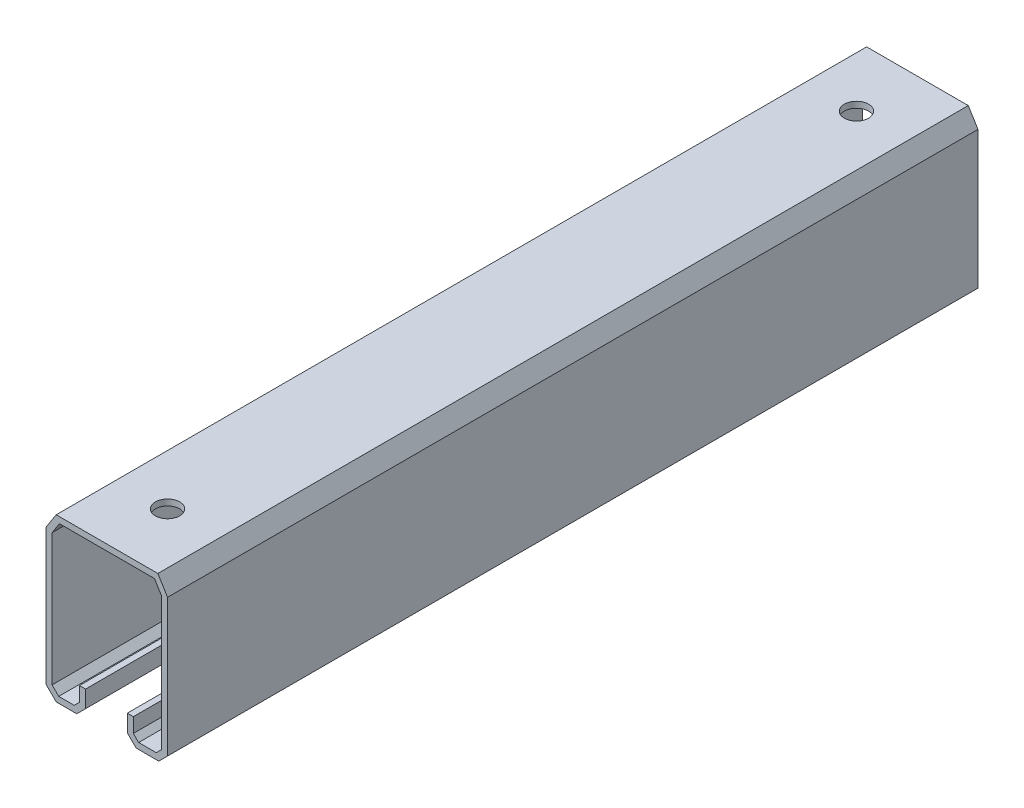
ISO-10303-21;
HEADER;
FILE_DESCRIPTION(('STEP AP214'),'2;1');
FILE_NAME('part.step','',(''),(''),'','','');
FILE_SCHEMA(('AUTOMOTIVE_DESIGN { 1 0 10303 214 1 1 1 1 }'));
ENDSEC;
DATA;
#1=APPLICATION_CONTEXT('core data for automotive mechanical design processes');
#2=APPLICATION_PROTOCOL_DEFINITION('international standard','automotive_design',2000,#1);
#3=PRODUCT_CONTEXT('',#1,'mechanical');
#4=PRODUCT('Part','Part','',(#3));
#5=PRODUCT_RELATED_PRODUCT_CATEGORY('part','',(#4));
#6=PRODUCT_DEFINITION_FORMATION('','',#4);
#7=PRODUCT_DEFINITION_CONTEXT('part definition',#1,'design');
#8=PRODUCT_DEFINITION('design','',#6,#7);
#9=PRODUCT_DEFINITION_SHAPE('','',#8);
#10=(LENGTH_UNIT() NAMED_UNIT(*) SI_UNIT(.MILLI.,.METRE.));
#11=(NAMED_UNIT(*) PLANE_ANGLE_UNIT() SI_UNIT($,.RADIAN.));
#12=(NAMED_UNIT(*) SI_UNIT($,.STERADIAN.) SOLID_ANGLE_UNIT());
#13=UNCERTAINTY_MEASURE_WITH_UNIT(LENGTH_MEASURE(1.E-05),#10,'distance_accuracy_value','');
#14=(GEOMETRIC_REPRESENTATION_CONTEXT(3) GLOBAL_UNCERTAINTY_ASSIGNED_CONTEXT((#13)) GLOBAL_UNIT_ASSIGNED_CONTEXT((#10,
#11,#12)) REPRESENTATION_CONTEXT('',''));
#15=CARTESIAN_POINT('',(0.,0.,0.));
#16=DIRECTION('',(0.,0.,1.));
#17=DIRECTION('',(1.,0.,0.));
#18=AXIS2_PLACEMENT_3D('',#15,#16,#17);
#19=CARTESIAN_POINT('',(-13.4697478975894,-27.2401516069639,200.));
#20=DIRECTION('',(0.,-1.,0.));
#21=DIRECTION('',(0.,0.,-1.));
#22=AXIS2_PLACEMENT_3D('',#19,#20,#21);
#23=PLANE('',#22);
#24=DIRECTION('',(-1.,0.,0.));
#25=VECTOR('',#24,1.);
#26=CARTESIAN_POINT('',(-13.4697478975894,-27.2401516069639,-200.));
#27=LINE('',#26,#25);
#28=CARTESIAN_POINT('',(-10.4697478975894,-27.2401516069639,-200.));
#29=VERTEX_POINT('',#28);
#30=CARTESIAN_POINT('',(-13.4697478975894,-27.2401516069639,-200.));
#31=VERTEX_POINT('',#30);
#32=EDGE_CURVE('E249',#29,#31,#27,.T.);
#33=ORIENTED_EDGE('',*,*,#32,.T.);
#34=DIRECTION('',(0.,0.,-1.));
#35=VECTOR('',#34,1.);
#36=CARTESIAN_POINT('',(-13.4697478975894,-27.2401516069639,200.));
#37=LINE('',#36,#35);
#38=CARTESIAN_POINT('',(-13.4697478975894,-27.2401516069639,200.));
#39=VERTEX_POINT('',#38);
#40=EDGE_CURVE('E11',#39,#31,#37,.T.);
#41=ORIENTED_EDGE('',*,*,#40,.F.);
#42=DIRECTION('',(-1.,0.,0.));
#43=VECTOR('',#42,1.);
#44=CARTESIAN_POINT('',(-13.4697478975894,-27.2401516069639,200.));
#45=LINE('',#44,#43);
#46=CARTESIAN_POINT('',(-10.4697478975894,-27.2401516069639,200.));
#47=VERTEX_POINT('',#46);
#48=EDGE_CURVE('E304',#47,#39,#45,.T.);
#49=ORIENTED_EDGE('',*,*,#48,.F.);
#50=DIRECTION('',(0.,0.,-1.));
#51=VECTOR('',#50,1.);
#52=CARTESIAN_POINT('',(-10.4697478975894,-27.2401516069639,200.));
#53=LINE('',#52,#51);
#54=EDGE_CURVE('E245',#47,#29,#53,.T.);
#55=ORIENTED_EDGE('',*,*,#54,.T.);
#56=EDGE_LOOP('',(#33,#41,#49,#55));
#57=FACE_BOUND('',#56,.T.);
#58=ADVANCED_FACE('F33',(#57),#23,.F.);
#59=CARTESIAN_POINT('',(-13.4697478975894,-27.2401516069639,200.));
#60=DIRECTION('',(1.,0.,0.));
#61=DIRECTION('',(0.,0.,-1.));
#62=AXIS2_PLACEMENT_3D('',#59,#60,#61);
#63=PLANE('',#62);
#64=DIRECTION('',(0.,-1.,0.));
#65=VECTOR('',#64,1.);
#66=CARTESIAN_POINT('',(-13.4697478975894,-27.2401516069639,-200.));
#67=LINE('',#66,#65);
#68=CARTESIAN_POINT('',(-13.4697478975894,-34.4082689863328,-200.));
#69=VERTEX_POINT('',#68);
#70=EDGE_CURVE('E252',#31,#69,#67,.T.);
#71=ORIENTED_EDGE('',*,*,#70,.T.);
#72=DIRECTION('',(0.,0.,-1.));
#73=VECTOR('',#72,1.);
#74=CARTESIAN_POINT('',(-13.4697478975894,-34.4082689863328,200.));
#75=LINE('',#74,#73);
#76=CARTESIAN_POINT('',(-13.4697478975894,-34.4082689863328,200.));
#77=VERTEX_POINT('',#76);
#78=EDGE_CURVE('E41',#77,#69,#75,.T.);
#79=ORIENTED_EDGE('',*,*,#78,.F.);
#80=DIRECTION('',(0.,-1.,0.));
#81=VECTOR('',#80,1.);
#82=CARTESIAN_POINT('',(-13.4697478975894,-27.2401516069639,200.));
#83=LINE('',#82,#81);
#84=EDGE_CURVE('E152',#39,#77,#83,.T.);
#85=ORIENTED_EDGE('',*,*,#84,.F.);
#86=ORIENTED_EDGE('',*,*,#40,.T.);
#87=EDGE_LOOP('',(#71,#79,#85,#86));
#88=FACE_BOUND('',#87,.T.);
#89=ADVANCED_FACE('F462',(#88),#63,.F.);
#90=CARTESIAN_POINT('',(-13.4697478975894,-34.4082689863328,200.));
#91=DIRECTION('',(0.707106781186566,-0.707106781186529,0.));
#92=DIRECTION('',(0.707106781186529,0.707106781186566,0.));
#93=AXIS2_PLACEMENT_3D('',#90,#91,#92);
#94=PLANE('',#93);
#95=DIRECTION('',(-0.707106781186529,-0.707106781186566,0.));
#96=VECTOR('',#95,1.);
#97=CARTESIAN_POINT('',(-13.4697478975894,-34.4082689863328,-200.));
#98=LINE('',#97,#96);
#99=CARTESIAN_POINT('',(-16.0614789112565,-37.,-200.));
#100=VERTEX_POINT('',#99);
#101=EDGE_CURVE('E255',#69,#100,#98,.T.);
#102=ORIENTED_EDGE('',*,*,#101,.T.);
#103=DIRECTION('',(0.,0.,-1.));
#104=VECTOR('',#103,1.);
#105=CARTESIAN_POINT('',(-16.0614789112565,-37.,200.));
#106=LINE('',#105,#104);
#107=CARTESIAN_POINT('',(-16.0614789112565,-37.,200.));
#108=VERTEX_POINT('',#107);
#109=EDGE_CURVE('E371',#108,#100,#106,.T.);
#110=ORIENTED_EDGE('',*,*,#109,.F.);
#111=DIRECTION('',(-0.707106781186529,-0.707106781186566,0.));
#112=VECTOR('',#111,1.);
#113=CARTESIAN_POINT('',(-13.4697478975894,-34.4082689863328,200.));
#114=LINE('',#113,#112);
#115=EDGE_CURVE('E379',#77,#108,#114,.T.);
#116=ORIENTED_EDGE('',*,*,#115,.F.);
#117=ORIENTED_EDGE('',*,*,#78,.T.);
#118=EDGE_LOOP('',(#102,#110,#116,#117));
#119=FACE_BOUND('',#118,.T.);
#120=ADVANCED_FACE('F377',(#119),#94,.F.);
#121=CARTESIAN_POINT('',(-16.0614789112565,-37.,200.));
#122=DIRECTION('',(0.,-1.,0.));
#123=DIRECTION('',(0.,0.,-1.));
#124=AXIS2_PLACEMENT_3D('',#121,#122,#123);
#125=PLANE('',#124);
#126=DIRECTION('',(-1.,0.,0.));
#127=VECTOR('',#126,1.);
#128=CARTESIAN_POINT('',(-16.0614789112565,-37.,-200.));
#129=LINE('',#128,#127);
#130=CARTESIAN_POINT('',(-23.7284142216565,-37.,-200.));
#131=VERTEX_POINT('',#130);
#132=EDGE_CURVE('E257',#100,#131,#129,.T.);
#133=ORIENTED_EDGE('',*,*,#132,.T.);
#134=DIRECTION('',(0.,0.,-1.));
#135=VECTOR('',#134,1.);
#136=CARTESIAN_POINT('',(-23.7284142216565,-37.,200.));
#137=LINE('',#136,#135);
#138=CARTESIAN_POINT('',(-23.7284142216565,-37.,200.));
#139=VERTEX_POINT('',#138);
#140=EDGE_CURVE('E368',#139,#131,#137,.T.);
#141=ORIENTED_EDGE('',*,*,#140,.F.);
#142=DIRECTION('',(-1.,0.,0.));
#143=VECTOR('',#142,1.);
#144=CARTESIAN_POINT('',(-16.0614789112565,-37.,200.));
#145=LINE('',#144,#143);
#146=EDGE_CURVE('E397',#108,#139,#145,.T.);
#147=ORIENTED_EDGE('',*,*,#146,.F.);
#148=ORIENTED_EDGE('',*,*,#109,.T.);
#149=EDGE_LOOP('',(#133,#141,#147,#148));
#150=FACE_BOUND('',#149,.T.);
#151=ADVANCED_FACE('F388',(#150),#125,.F.);
#152=CARTESIAN_POINT('',(-23.7284142216565,-37.,200.));
#153=DIRECTION('',(-0.70710678118653,-0.707106781186565,0.));
#154=DIRECTION('',(0.707106781186565,-0.70710678118653,0.));
#155=AXIS2_PLACEMENT_3D('',#152,#153,#154);
#156=PLANE('',#155);
#157=DIRECTION('',(-0.707106781186565,0.70710678118653,0.));
#158=VECTOR('',#157,1.);
#159=CARTESIAN_POINT('',(-23.7284142216565,-37.,-200.));
#160=LINE('',#159,#158);
#161=CARTESIAN_POINT('',(-27.,-33.7284142216567,-200.));
#162=VERTEX_POINT('',#161);
#163=EDGE_CURVE('E259',#131,#162,#160,.T.);
#164=ORIENTED_EDGE('',*,*,#163,.T.);
#165=DIRECTION('',(0.,0.,-1.));
#166=VECTOR('',#165,1.);
#167=CARTESIAN_POINT('',(-27.,-33.7284142216567,200.));
#168=LINE('',#167,#166);
#169=CARTESIAN_POINT('',(-27.,-33.7284142216567,200.));
#170=VERTEX_POINT('',#169);
#171=EDGE_CURVE('E365',#170,#162,#168,.T.);
#172=ORIENTED_EDGE('',*,*,#171,.F.);
#173=DIRECTION('',(-0.707106781186565,0.70710678118653,0.));
#174=VECTOR('',#173,1.);
#175=CARTESIAN_POINT('',(-23.7284142216565,-37.,200.));
#176=LINE('',#175,#174);
#177=EDGE_CURVE('E394',#139,#170,#176,.T.);
#178=ORIENTED_EDGE('',*,*,#177,.F.);
#179=ORIENTED_EDGE('',*,*,#140,.T.);
#180=EDGE_LOOP('',(#164,#172,#178,#179));
#181=FACE_BOUND('',#180,.T.);
#182=ADVANCED_FACE('F392',(#181),#156,.F.);
#183=CARTESIAN_POINT('',(-27.,-33.7284142216567,200.));
#184=DIRECTION('',(-1.,0.,0.));
#185=DIRECTION('',(0.,0.,1.));
#186=AXIS2_PLACEMENT_3D('',#183,#184,#185);
#187=PLANE('',#186);
#188=DIRECTION('',(0.,1.,0.));
#189=VECTOR('',#188,1.);
#190=CARTESIAN_POINT('',(-27.,-33.7284142216567,-200.));
#191=LINE('',#190,#189);
#192=CARTESIAN_POINT('',(-27.,31.3304865883881,-200.));
#193=VERTEX_POINT('',#192);
#194=EDGE_CURVE('E261',#162,#193,#191,.T.);
#195=ORIENTED_EDGE('',*,*,#194,.T.);
#196=DIRECTION('',(0.,0.,-1.));
#197=VECTOR('',#196,1.);
#198=CARTESIAN_POINT('',(-27.,31.3304865883881,200.));
#199=LINE('',#198,#197);
#200=CARTESIAN_POINT('',(-27.,31.3304865883881,200.));
#201=VERTEX_POINT('',#200);
#202=EDGE_CURVE('E362',#201,#193,#199,.T.);
#203=ORIENTED_EDGE('',*,*,#202,.F.);
#204=DIRECTION('',(0.,1.,0.));
#205=VECTOR('',#204,1.);
#206=CARTESIAN_POINT('',(-27.,-33.7284142216567,200.));
#207=LINE('',#206,#205);
#208=EDGE_CURVE('E396',#170,#201,#207,.T.);
#209=ORIENTED_EDGE('',*,*,#208,.F.);
#210=ORIENTED_EDGE('',*,*,#171,.T.);
#211=EDGE_LOOP('',(#195,#203,#209,#210));
#212=FACE_BOUND('',#211,.T.);
#213=ADVANCED_FACE('F475',(#212),#187,.F.);
#214=CARTESIAN_POINT('',(-27.,31.3304865883881,200.));
#215=DIRECTION('',(-0.839977099175069,0.542621850704002,0.));
#216=DIRECTION('',(-0.542621850704002,-0.839977099175069,0.));
#217=AXIS2_PLACEMENT_3D('',#214,#215,#216);
#218=PLANE('',#217);
#219=DIRECTION('',(0.542621850704002,0.839977099175069,0.));
#220=VECTOR('',#219,1.);
#221=CARTESIAN_POINT('',(-27.,31.3304865883881,-200.));
#222=LINE('',#221,#220);
#223=CARTESIAN_POINT('',(-23.3375169834733,37.,-200.));
#224=VERTEX_POINT('',#223);
#225=EDGE_CURVE('E263',#193,#224,#222,.T.);
#226=ORIENTED_EDGE('',*,*,#225,.T.);
#227=DIRECTION('',(0.,0.,-1.));
#228=VECTOR('',#227,1.);
#229=CARTESIAN_POINT('',(-23.3375169834733,37.,200.));
#230=LINE('',#229,#228);
#231=CARTESIAN_POINT('',(-23.3375169834733,37.,200.));
#232=VERTEX_POINT('',#231);
#233=EDGE_CURVE('E359',#232,#224,#230,.T.);
#234=ORIENTED_EDGE('',*,*,#233,.F.);
#235=DIRECTION('',(0.542621850704002,0.839977099175069,0.));
#236=VECTOR('',#235,1.);
#237=CARTESIAN_POINT('',(-27.,31.3304865883881,200.));
#238=LINE('',#237,#236);
#239=EDGE_CURVE('E399',#201,#232,#238,.T.);
#240=ORIENTED_EDGE('',*,*,#239,.F.);
#241=ORIENTED_EDGE('',*,*,#202,.T.);
#242=EDGE_LOOP('',(#226,#234,#240,#241));
#243=FACE_BOUND('',#242,.T.);
#244=ADVANCED_FACE('F478',(#243),#218,.F.);
#245=CARTESIAN_POINT('',(-23.3375169834733,37.,200.));
#246=DIRECTION('',(0.,1.,0.));
#247=DIRECTION('',(0.,0.,1.));
#248=AXIS2_PLACEMENT_3D('',#245,#246,#247);
#249=PLANE('',#248);
#250=CARTESIAN_POINT('',(0.,37.,170.));
#251=DIRECTION('',(0.,1.,0.));
#252=DIRECTION('',(0.,0.,1.));
#253=AXIS2_PLACEMENT_3D('',#250,#251,#252);
#254=CIRCLE('',#253,6.00000000000001);
#255=CARTESIAN_POINT('',(0.,37.,176.));
#256=VERTEX_POINT('',#255);
#257=EDGE_CURVE('E623',#256,#256,#254,.T.);
#258=ORIENTED_EDGE('',*,*,#257,.T.);
#259=EDGE_LOOP('',(#258));
#260=FACE_BOUND('',#259,.T.);
#261=CARTESIAN_POINT('',(0.,37.,-170.));
#262=DIRECTION('',(0.,1.,0.));
#263=DIRECTION('',(0.,0.,1.));
#264=AXIS2_PLACEMENT_3D('',#261,#262,#263);
#265=CIRCLE('',#264,6.00000000000001);
#266=CARTESIAN_POINT('',(0.,37.,-164.));
#267=VERTEX_POINT('',#266);
#268=EDGE_CURVE('E253',#267,#267,#265,.T.);
#269=ORIENTED_EDGE('',*,*,#268,.T.);
#270=EDGE_LOOP('',(#269));
#271=FACE_BOUND('',#270,.T.);
#272=DIRECTION('',(1.,0.,0.));
#273=VECTOR('',#272,1.);
#274=CARTESIAN_POINT('',(-23.3375169834733,37.,-200.));
#275=LINE('',#274,#273);
#276=CARTESIAN_POINT('',(23.5281616089065,37.,-200.));
#277=VERTEX_POINT('',#276);
#278=EDGE_CURVE('E265',#224,#277,#275,.T.);
#279=ORIENTED_EDGE('',*,*,#278,.T.);
#280=DIRECTION('',(0.,0.,-1.));
#281=VECTOR('',#280,1.);
#282=CARTESIAN_POINT('',(23.5281616089065,37.,200.));
#283=LINE('',#282,#281);
#284=CARTESIAN_POINT('',(23.5281616089065,37.,200.));
#285=VERTEX_POINT('',#284);
#286=EDGE_CURVE('E356',#285,#277,#283,.T.);
#287=ORIENTED_EDGE('',*,*,#286,.F.);
#288=DIRECTION('',(1.,0.,0.));
#289=VECTOR('',#288,1.);
#290=CARTESIAN_POINT('',(-23.3375169834733,37.,200.));
#291=LINE('',#290,#289);
#292=EDGE_CURVE('E405',#232,#285,#291,.T.);
#293=ORIENTED_EDGE('',*,*,#292,.F.);
#294=ORIENTED_EDGE('',*,*,#233,.T.);
#295=EDGE_LOOP('',(#279,#287,#293,#294));
#296=FACE_BOUND('',#295,.T.);
#297=ADVANCED_FACE('F482',(#260,#271,#296),#249,.F.);
#298=CARTESIAN_POINT('',(23.5281616089065,37.,200.));
#299=DIRECTION('',(0.851370627573585,0.524564633295993,0.));
#300=DIRECTION('',(-0.524564633295993,0.851370627573585,0.));
#301=AXIS2_PLACEMENT_3D('',#298,#299,#300);
#302=PLANE('',#301);
#303=DIRECTION('',(0.524564633295993,-0.851370627573585,0.));
#304=VECTOR('',#303,1.);
#305=CARTESIAN_POINT('',(23.5281616089065,37.,-200.));
#306=LINE('',#305,#304);
#307=CARTESIAN_POINT('',(27.,31.3651915469653,-200.));
#308=VERTEX_POINT('',#307);
#309=EDGE_CURVE('E267',#277,#308,#306,.T.);
#310=ORIENTED_EDGE('',*,*,#309,.T.);
#311=DIRECTION('',(0.,0.,-1.));
#312=VECTOR('',#311,1.);
#313=CARTESIAN_POINT('',(27.,31.3651915469653,200.));
#314=LINE('',#313,#312);
#315=CARTESIAN_POINT('',(27.,31.3651915469653,200.));
#316=VERTEX_POINT('',#315);
#317=EDGE_CURVE('E353',#316,#308,#314,.T.);
#318=ORIENTED_EDGE('',*,*,#317,.F.);
#319=DIRECTION('',(0.524564633295993,-0.851370627573585,0.));
#320=VECTOR('',#319,1.);
#321=CARTESIAN_POINT('',(23.5281616089065,37.,200.));
#322=LINE('',#321,#320);
#323=EDGE_CURVE('E407',#285,#316,#322,.T.);
#324=ORIENTED_EDGE('',*,*,#323,.F.);
#325=ORIENTED_EDGE('',*,*,#286,.T.);
#326=EDGE_LOOP('',(#310,#318,#324,#325));
#327=FACE_BOUND('',#326,.T.);
#328=ADVANCED_FACE('F486',(#327),#302,.F.);
#329=CARTESIAN_POINT('',(27.,31.3651915469653,200.));
#330=DIRECTION('',(1.,0.,0.));
#331=DIRECTION('',(0.,0.,-1.));
#332=AXIS2_PLACEMENT_3D('',#329,#330,#331);
#333=PLANE('',#332);
#334=DIRECTION('',(0.,-1.,0.));
#335=VECTOR('',#334,1.);
#336=CARTESIAN_POINT('',(27.,31.3651915469653,-200.));
#337=LINE('',#336,#335);
#338=CARTESIAN_POINT('',(27.,-34.4082689863328,-200.));
#339=VERTEX_POINT('',#338);
#340=EDGE_CURVE('E269',#308,#339,#337,.T.);
#341=ORIENTED_EDGE('',*,*,#340,.T.);
#342=DIRECTION('',(0.,0.,-1.));
#343=VECTOR('',#342,1.);
#344=CARTESIAN_POINT('',(27.,-34.4082689863328,200.));
#345=LINE('',#344,#343);
#346=CARTESIAN_POINT('',(27.,-34.4082689863328,200.));
#347=VERTEX_POINT('',#346);
#348=EDGE_CURVE('E350',#347,#339,#345,.T.);
#349=ORIENTED_EDGE('',*,*,#348,.F.);
#350=DIRECTION('',(0.,-1.,0.));
#351=VECTOR('',#350,1.);
#352=CARTESIAN_POINT('',(27.,31.3651915469653,200.));
#353=LINE('',#352,#351);
#354=EDGE_CURVE('E409',#316,#347,#353,.T.);
#355=ORIENTED_EDGE('',*,*,#354,.F.);
#356=ORIENTED_EDGE('',*,*,#317,.T.);
#357=EDGE_LOOP('',(#341,#349,#355,#356));
#358=FACE_BOUND('',#357,.T.);
#359=ADVANCED_FACE('F490',(#358),#333,.F.);
#360=CARTESIAN_POINT('',(27.,-34.4082689863328,200.));
#361=DIRECTION('',(0.707106781186566,-0.70710678118653,0.));
#362=DIRECTION('',(0.70710678118653,0.707106781186566,0.));
#363=AXIS2_PLACEMENT_3D('',#360,#361,#362);
#364=PLANE('',#363);
#365=DIRECTION('',(-0.70710678118653,-0.707106781186566,0.));
#366=VECTOR('',#365,1.);
#367=CARTESIAN_POINT('',(27.,-34.4082689863328,-200.));
#368=LINE('',#367,#366);
#369=CARTESIAN_POINT('',(24.4082689863329,-37.,-200.));
#370=VERTEX_POINT('',#369);
#371=EDGE_CURVE('E271',#339,#370,#368,.T.);
#372=ORIENTED_EDGE('',*,*,#371,.T.);
#373=DIRECTION('',(0.,0.,-1.));
#374=VECTOR('',#373,1.);
#375=CARTESIAN_POINT('',(24.4082689863329,-37.,200.));
#376=LINE('',#375,#374);
#377=CARTESIAN_POINT('',(24.4082689863329,-37.,200.));
#378=VERTEX_POINT('',#377);
#379=EDGE_CURVE('E347',#378,#370,#376,.T.);
#380=ORIENTED_EDGE('',*,*,#379,.F.);
#381=DIRECTION('',(-0.70710678118653,-0.707106781186566,0.));
#382=VECTOR('',#381,1.);
#383=CARTESIAN_POINT('',(27.,-34.4082689863328,200.));
#384=LINE('',#383,#382);
#385=EDGE_CURVE('E411',#347,#378,#384,.T.);
#386=ORIENTED_EDGE('',*,*,#385,.F.);
#387=ORIENTED_EDGE('',*,*,#348,.T.);
#388=EDGE_LOOP('',(#372,#380,#386,#387));
#389=FACE_BOUND('',#388,.T.);
#390=ADVANCED_FACE('F494',(#389),#364,.F.);
#391=CARTESIAN_POINT('',(24.4082689863329,-37.,200.));
#392=DIRECTION('',(0.,-1.,0.));
#393=DIRECTION('',(0.,0.,-1.));
#394=AXIS2_PLACEMENT_3D('',#391,#392,#393);
#395=PLANE('',#394);
#396=DIRECTION('',(-1.,0.,0.));
#397=VECTOR('',#396,1.);
#398=CARTESIAN_POINT('',(24.4082689863329,-37.,-200.));
#399=LINE('',#398,#397);
#400=CARTESIAN_POINT('',(15.7151408487704,-37.,-200.));
#401=VERTEX_POINT('',#400);
#402=EDGE_CURVE('E273',#370,#401,#399,.T.);
#403=ORIENTED_EDGE('',*,*,#402,.T.);
#404=DIRECTION('',(0.,0.,-1.));
#405=VECTOR('',#404,1.);
#406=CARTESIAN_POINT('',(15.7151408487704,-37.,200.));
#407=LINE('',#406,#405);
#408=CARTESIAN_POINT('',(15.7151408487704,-37.,200.));
#409=VERTEX_POINT('',#408);
#410=EDGE_CURVE('E344',#409,#401,#407,.T.);
#411=ORIENTED_EDGE('',*,*,#410,.F.);
#412=DIRECTION('',(-1.,0.,0.));
#413=VECTOR('',#412,1.);
#414=CARTESIAN_POINT('',(24.4082689863329,-37.,200.));
#415=LINE('',#414,#413);
#416=EDGE_CURVE('E413',#378,#409,#415,.T.);
#417=ORIENTED_EDGE('',*,*,#416,.F.);
#418=ORIENTED_EDGE('',*,*,#379,.T.);
#419=EDGE_LOOP('',(#403,#411,#417,#418));
#420=FACE_BOUND('',#419,.T.);
#421=ADVANCED_FACE('F498',(#420),#395,.F.);
#422=CARTESIAN_POINT('',(15.7151408487704,-37.,200.));
#423=DIRECTION('',(-0.707106781186529,-0.707106781186566,0.));
#424=DIRECTION('',(0.707106781186566,-0.707106781186529,0.));
#425=AXIS2_PLACEMENT_3D('',#422,#423,#424);
#426=PLANE('',#425);
#427=DIRECTION('',(-0.707106781186566,0.707106781186529,0.));
#428=VECTOR('',#427,1.);
#429=CARTESIAN_POINT('',(15.7151408487704,-37.,-200.));
#430=LINE('',#429,#428);
#431=CARTESIAN_POINT('',(13.1234098351029,-34.4082689863327,-200.));
#432=VERTEX_POINT('',#431);
#433=EDGE_CURVE('E275',#401,#432,#430,.T.);
#434=ORIENTED_EDGE('',*,*,#433,.T.);
#435=DIRECTION('',(0.,0.,-1.));
#436=VECTOR('',#435,1.);
#437=CARTESIAN_POINT('',(13.1234098351029,-34.4082689863327,200.));
#438=LINE('',#437,#436);
#439=CARTESIAN_POINT('',(13.1234098351029,-34.4082689863327,200.));
#440=VERTEX_POINT('',#439);
#441=EDGE_CURVE('E341',#440,#432,#438,.T.);
#442=ORIENTED_EDGE('',*,*,#441,.F.);
#443=DIRECTION('',(-0.707106781186566,0.707106781186529,0.));
#444=VECTOR('',#443,1.);
#445=CARTESIAN_POINT('',(15.7151408487704,-37.,200.));
#446=LINE('',#445,#444);
#447=EDGE_CURVE('E415',#409,#440,#446,.T.);
#448=ORIENTED_EDGE('',*,*,#447,.F.);
#449=ORIENTED_EDGE('',*,*,#410,.T.);
#450=EDGE_LOOP('',(#434,#442,#448,#449));
#451=FACE_BOUND('',#450,.T.);
#452=ADVANCED_FACE('F502',(#451),#426,.F.);
#453=CARTESIAN_POINT('',(13.1234098351029,-34.4082689863327,200.));
#454=DIRECTION('',(-1.,0.,0.));
#455=DIRECTION('',(0.,0.,1.));
#456=AXIS2_PLACEMENT_3D('',#453,#454,#455);
#457=PLANE('',#456);
#458=DIRECTION('',(0.,1.,0.));
#459=VECTOR('',#458,1.);
#460=CARTESIAN_POINT('',(13.1234098351029,-34.4082689863327,-200.));
#461=LINE('',#460,#459);
#462=CARTESIAN_POINT('',(13.1234098351029,-27.2401516069639,-200.));
#463=VERTEX_POINT('',#462);
#464=EDGE_CURVE('E277',#432,#463,#461,.T.);
#465=ORIENTED_EDGE('',*,*,#464,.T.);
#466=DIRECTION('',(0.,0.,-1.));
#467=VECTOR('',#466,1.);
#468=CARTESIAN_POINT('',(13.1234098351029,-27.2401516069639,200.));
#469=LINE('',#468,#467);
#470=CARTESIAN_POINT('',(13.1234098351029,-27.2401516069639,200.));
#471=VERTEX_POINT('',#470);
#472=EDGE_CURVE('E338',#471,#463,#469,.T.);
#473=ORIENTED_EDGE('',*,*,#472,.F.);
#474=DIRECTION('',(0.,1.,0.));
#475=VECTOR('',#474,1.);
#476=CARTESIAN_POINT('',(13.1234098351029,-34.4082689863327,200.));
#477=LINE('',#476,#475);
#478=EDGE_CURVE('E417',#440,#471,#477,.T.);
#479=ORIENTED_EDGE('',*,*,#478,.F.);
#480=ORIENTED_EDGE('',*,*,#441,.T.);
#481=EDGE_LOOP('',(#465,#473,#479,#480));
#482=FACE_BOUND('',#481,.T.);
#483=ADVANCED_FACE('F506',(#482),#457,.F.);
#484=CARTESIAN_POINT('',(10.1234098351029,-27.2401516069639,200.));
#485=DIRECTION('',(0.,-1.,0.));
#486=DIRECTION('',(0.,0.,-1.));
#487=AXIS2_PLACEMENT_3D('',#484,#485,#486);
#488=PLANE('',#487);
#489=DIRECTION('',(-1.,0.,0.));
#490=VECTOR('',#489,1.);
#491=CARTESIAN_POINT('',(10.1234098351029,-27.2401516069639,-200.));
#492=LINE('',#491,#490);
#493=CARTESIAN_POINT('',(10.1234098351029,-27.2401516069639,-200.));
#494=VERTEX_POINT('',#493);
#495=EDGE_CURVE('E279',#463,#494,#492,.T.);
#496=ORIENTED_EDGE('',*,*,#495,.T.);
#497=DIRECTION('',(0.,0.,-1.));
#498=VECTOR('',#497,1.);
#499=CARTESIAN_POINT('',(10.1234098351029,-27.2401516069639,200.));
#500=LINE('',#499,#498);
#501=CARTESIAN_POINT('',(10.1234098351029,-27.2401516069639,200.));
#502=VERTEX_POINT('',#501);
#503=EDGE_CURVE('E335',#502,#494,#500,.T.);
#504=ORIENTED_EDGE('',*,*,#503,.F.);
#505=DIRECTION('',(-1.,0.,0.));
#506=VECTOR('',#505,1.);
#507=CARTESIAN_POINT('',(10.1234098351029,-27.2401516069639,200.));
#508=LINE('',#507,#506);
#509=EDGE_CURVE('E419',#471,#502,#508,.T.);
#510=ORIENTED_EDGE('',*,*,#509,.F.);
#511=ORIENTED_EDGE('',*,*,#472,.T.);
#512=EDGE_LOOP('',(#496,#504,#510,#511));
#513=FACE_BOUND('',#512,.T.);
#514=ADVANCED_FACE('F510',(#513),#488,.F.);
#515=CARTESIAN_POINT('',(10.123409835103,-35.650909673452,200.));
#516=DIRECTION('',(1.,0.,0.));
#517=DIRECTION('',(0.,1.,0.));
#518=AXIS2_PLACEMENT_3D('',#515,#516,#517);
#519=PLANE('',#518);
#520=DIRECTION('',(0.,-1.,0.));
#521=VECTOR('',#520,1.);
#522=CARTESIAN_POINT('',(10.123409835103,-35.650909673452,-200.));
#523=LINE('',#522,#521);
#524=CARTESIAN_POINT('',(10.123409835103,-35.650909673452,-200.));
#525=VERTEX_POINT('',#524);
#526=EDGE_CURVE('E281',#494,#525,#523,.T.);
#527=ORIENTED_EDGE('',*,*,#526,.T.);
#528=DIRECTION('',(0.,0.,-1.));
#529=VECTOR('',#528,1.);
#530=CARTESIAN_POINT('',(10.123409835103,-35.650909673452,200.));
#531=LINE('',#530,#529);
#532=CARTESIAN_POINT('',(10.123409835103,-35.650909673452,200.));
#533=VERTEX_POINT('',#532);
#534=EDGE_CURVE('E332',#533,#525,#531,.T.);
#535=ORIENTED_EDGE('',*,*,#534,.F.);
#536=DIRECTION('',(0.,-1.,0.));
#537=VECTOR('',#536,1.);
#538=CARTESIAN_POINT('',(10.123409835103,-35.650909673452,200.));
#539=LINE('',#538,#537);
#540=EDGE_CURVE('E421',#502,#533,#539,.T.);
#541=ORIENTED_EDGE('',*,*,#540,.F.);
#542=ORIENTED_EDGE('',*,*,#503,.T.);
#543=EDGE_LOOP('',(#527,#535,#541,#542));
#544=FACE_BOUND('',#543,.T.);
#545=ADVANCED_FACE('F514',(#544),#519,.F.);
#546=CARTESIAN_POINT('',(14.4725001616512,-40.,200.));
#547=DIRECTION('',(0.70710678118653,0.707106781186565,0.));
#548=DIRECTION('',(-0.707106781186565,0.70710678118653,0.));
#549=AXIS2_PLACEMENT_3D('',#546,#547,#548);
#550=PLANE('',#549);
#551=DIRECTION('',(0.707106781186565,-0.70710678118653,0.));
#552=VECTOR('',#551,1.);
#553=CARTESIAN_POINT('',(14.4725001616512,-40.,-200.));
#554=LINE('',#553,#552);
#555=CARTESIAN_POINT('',(14.4725001616512,-40.,-200.));
#556=VERTEX_POINT('',#555);
#557=EDGE_CURVE('E283',#525,#556,#554,.T.);
#558=ORIENTED_EDGE('',*,*,#557,.T.);
#559=DIRECTION('',(0.,0.,-1.));
#560=VECTOR('',#559,1.);
#561=CARTESIAN_POINT('',(14.4725001616512,-40.,200.));
#562=LINE('',#561,#560);
#563=CARTESIAN_POINT('',(14.4725001616512,-40.,200.));
#564=VERTEX_POINT('',#563);
#565=EDGE_CURVE('E329',#564,#556,#562,.T.);
#566=ORIENTED_EDGE('',*,*,#565,.F.);
#567=DIRECTION('',(0.707106781186565,-0.70710678118653,0.));
#568=VECTOR('',#567,1.);
#569=CARTESIAN_POINT('',(14.4725001616512,-40.,200.));
#570=LINE('',#569,#568);
#571=EDGE_CURVE('E423',#533,#564,#570,.T.);
#572=ORIENTED_EDGE('',*,*,#571,.F.);
#573=ORIENTED_EDGE('',*,*,#534,.T.);
#574=EDGE_LOOP('',(#558,#566,#572,#573));
#575=FACE_BOUND('',#574,.T.);
#576=ADVANCED_FACE('F518',(#575),#550,.F.);
#577=CARTESIAN_POINT('',(25.6509096734522,-40.,200.));
#578=DIRECTION('',(0.,1.,0.));
#579=DIRECTION('',(-1.,0.,0.));
#580=AXIS2_PLACEMENT_3D('',#577,#578,#579);
#581=PLANE('',#580);
#582=DIRECTION('',(1.,0.,0.));
#583=VECTOR('',#582,1.);
#584=CARTESIAN_POINT('',(25.6509096734522,-40.,-200.));
#585=LINE('',#584,#583);
#586=CARTESIAN_POINT('',(25.6509096734522,-40.,-200.));
#587=VERTEX_POINT('',#586);
#588=EDGE_CURVE('E285',#556,#587,#585,.T.);
#589=ORIENTED_EDGE('',*,*,#588,.T.);
#590=DIRECTION('',(0.,0.,-1.));
#591=VECTOR('',#590,1.);
#592=CARTESIAN_POINT('',(25.6509096734522,-40.,200.));
#593=LINE('',#592,#591);
#594=CARTESIAN_POINT('',(25.6509096734522,-40.,200.));
#595=VERTEX_POINT('',#594);
#596=EDGE_CURVE('E326',#595,#587,#593,.T.);
#597=ORIENTED_EDGE('',*,*,#596,.F.);
#598=DIRECTION('',(1.,0.,0.));
#599=VECTOR('',#598,1.);
#600=CARTESIAN_POINT('',(25.6509096734522,-40.,200.));
#601=LINE('',#600,#599);
#602=EDGE_CURVE('E425',#564,#595,#601,.T.);
#603=ORIENTED_EDGE('',*,*,#602,.F.);
#604=ORIENTED_EDGE('',*,*,#565,.T.);
#605=EDGE_LOOP('',(#589,#597,#603,#604));
#606=FACE_BOUND('',#605,.T.);
#607=ADVANCED_FACE('F522',(#606),#581,.F.);
#608=CARTESIAN_POINT('',(30.,-35.650909673452,200.));
#609=DIRECTION('',(-0.707106781186567,0.707106781186528,0.));
#610=DIRECTION('',(-0.707106781186528,-0.707106781186567,0.));
#611=AXIS2_PLACEMENT_3D('',#608,#609,#610);
#612=PLANE('',#611);
#613=DIRECTION('',(0.707106781186528,0.707106781186567,0.));
#614=VECTOR('',#613,1.);
#615=CARTESIAN_POINT('',(30.,-35.650909673452,-200.));
#616=LINE('',#615,#614);
#617=CARTESIAN_POINT('',(30.,-35.650909673452,-200.));
#618=VERTEX_POINT('',#617);
#619=EDGE_CURVE('E287',#587,#618,#616,.T.);
#620=ORIENTED_EDGE('',*,*,#619,.T.);
#621=DIRECTION('',(0.,0.,-1.));
#622=VECTOR('',#621,1.);
#623=CARTESIAN_POINT('',(30.,-35.650909673452,200.));
#624=LINE('',#623,#622);
#625=CARTESIAN_POINT('',(30.,-35.650909673452,200.));
#626=VERTEX_POINT('',#625);
#627=EDGE_CURVE('E323',#626,#618,#624,.T.);
#628=ORIENTED_EDGE('',*,*,#627,.F.);
#629=DIRECTION('',(0.707106781186528,0.707106781186567,0.));
#630=VECTOR('',#629,1.);
#631=CARTESIAN_POINT('',(30.,-35.650909673452,200.));
#632=LINE('',#631,#630);
#633=EDGE_CURVE('E427',#595,#626,#632,.T.);
#634=ORIENTED_EDGE('',*,*,#633,.F.);
#635=ORIENTED_EDGE('',*,*,#596,.T.);
#636=EDGE_LOOP('',(#620,#628,#634,#635));
#637=FACE_BOUND('',#636,.T.);
#638=ADVANCED_FACE('F526',(#637),#612,.F.);
#639=CARTESIAN_POINT('',(30.,32.2152071389003,200.));
#640=DIRECTION('',(-1.,0.,0.));
#641=DIRECTION('',(0.,0.,1.));
#642=AXIS2_PLACEMENT_3D('',#639,#640,#641);
#643=PLANE('',#642);
#644=DIRECTION('',(0.,1.,0.));
#645=VECTOR('',#644,1.);
#646=CARTESIAN_POINT('',(30.,32.2152071389003,-200.));
#647=LINE('',#646,#645);
#648=CARTESIAN_POINT('',(30.,32.2152071389003,-200.));
#649=VERTEX_POINT('',#648);
#650=EDGE_CURVE('E289',#618,#649,#647,.T.);
#651=ORIENTED_EDGE('',*,*,#650,.T.);
#652=DIRECTION('',(0.,0.,-1.));
#653=VECTOR('',#652,1.);
#654=CARTESIAN_POINT('',(30.,32.2152071389003,200.));
#655=LINE('',#654,#653);
#656=CARTESIAN_POINT('',(30.,32.2152071389003,200.));
#657=VERTEX_POINT('',#656);
#658=EDGE_CURVE('E320',#657,#649,#655,.T.);
#659=ORIENTED_EDGE('',*,*,#658,.F.);
#660=DIRECTION('',(0.,1.,0.));
#661=VECTOR('',#660,1.);
#662=CARTESIAN_POINT('',(30.,32.2152071389003,200.));
#663=LINE('',#662,#661);
#664=EDGE_CURVE('E429',#626,#657,#663,.T.);
#665=ORIENTED_EDGE('',*,*,#664,.F.);
#666=ORIENTED_EDGE('',*,*,#627,.T.);
#667=EDGE_LOOP('',(#651,#659,#665,#666));
#668=FACE_BOUND('',#667,.T.);
#669=ADVANCED_FACE('F530',(#668),#643,.F.);
#670=CARTESIAN_POINT('',(25.2034673499291,40.,200.));
#671=DIRECTION('',(-0.851370627573586,-0.524564633295993,0.));
#672=DIRECTION('',(0.524564633295993,-0.851370627573586,0.));
#673=AXIS2_PLACEMENT_3D('',#670,#671,#672);
#674=PLANE('',#673);
#675=DIRECTION('',(-0.524564633295993,0.851370627573585,0.));
#676=VECTOR('',#675,1.);
#677=CARTESIAN_POINT('',(25.2034673499291,40.,-200.));
#678=LINE('',#677,#676);
#679=CARTESIAN_POINT('',(25.2034673499291,40.,-200.));
#680=VERTEX_POINT('',#679);
#681=EDGE_CURVE('E291',#649,#680,#678,.T.);
#682=ORIENTED_EDGE('',*,*,#681,.T.);
#683=DIRECTION('',(0.,0.,-1.));
#684=VECTOR('',#683,1.);
#685=CARTESIAN_POINT('',(25.2034673499291,40.,200.));
#686=LINE('',#685,#684);
#687=CARTESIAN_POINT('',(25.2034673499291,40.,200.));
#688=VERTEX_POINT('',#687);
#689=EDGE_CURVE('E317',#688,#680,#686,.T.);
#690=ORIENTED_EDGE('',*,*,#689,.F.);
#691=DIRECTION('',(-0.524564633295993,0.851370627573585,0.));
#692=VECTOR('',#691,1.);
#693=CARTESIAN_POINT('',(25.2034673499291,40.,200.));
#694=LINE('',#693,#692);
#695=EDGE_CURVE('E431',#657,#688,#694,.T.);
#696=ORIENTED_EDGE('',*,*,#695,.F.);
#697=ORIENTED_EDGE('',*,*,#658,.T.);
#698=EDGE_LOOP('',(#682,#690,#696,#697));
#699=FACE_BOUND('',#698,.T.);
#700=ADVANCED_FACE('F534',(#699),#674,.F.);
#701=CARTESIAN_POINT('',(-24.9710549087758,40.,200.));
#702=DIRECTION('',(0.,-1.,0.));
#703=DIRECTION('',(0.,0.,-1.));
#704=AXIS2_PLACEMENT_3D('',#701,#702,#703);
#705=PLANE('',#704);
#706=CARTESIAN_POINT('',(0.,40.,170.));
#707=DIRECTION('',(0.,1.,0.));
#708=DIRECTION('',(0.,0.,1.));
#709=AXIS2_PLACEMENT_3D('',#706,#707,#708);
#710=CIRCLE('',#709,6.00000000000001);
#711=CARTESIAN_POINT('',(0.,40.,176.));
#712=VERTEX_POINT('',#711);
#713=EDGE_CURVE('E620',#712,#712,#710,.T.);
#714=ORIENTED_EDGE('',*,*,#713,.F.);
#715=EDGE_LOOP('',(#714));
#716=FACE_BOUND('',#715,.T.);
#717=CARTESIAN_POINT('',(0.,40.,-170.));
#718=DIRECTION('',(0.,1.,0.));
#719=DIRECTION('',(0.,0.,1.));
#720=AXIS2_PLACEMENT_3D('',#717,#718,#719);
#721=CIRCLE('',#720,6.00000000000001);
#722=CARTESIAN_POINT('',(0.,40.,-164.));
#723=VERTEX_POINT('',#722);
#724=EDGE_CURVE('E624',#723,#723,#721,.T.);
#725=ORIENTED_EDGE('',*,*,#724,.F.);
#726=EDGE_LOOP('',(#725));
#727=FACE_BOUND('',#726,.T.);
#728=DIRECTION('',(-1.,0.,0.));
#729=VECTOR('',#728,1.);
#730=CARTESIAN_POINT('',(-24.9710549087758,40.,-200.));
#731=LINE('',#730,#729);
#732=CARTESIAN_POINT('',(-24.9710549087758,40.,-200.));
#733=VERTEX_POINT('',#732);
#734=EDGE_CURVE('E293',#680,#733,#731,.T.);
#735=ORIENTED_EDGE('',*,*,#734,.T.);
#736=DIRECTION('',(0.,0.,-1.));
#737=VECTOR('',#736,1.);
#738=CARTESIAN_POINT('',(-24.9710549087758,40.,200.));
#739=LINE('',#738,#737);
#740=CARTESIAN_POINT('',(-24.9710549087758,40.,200.));
#741=VERTEX_POINT('',#740);
#742=EDGE_CURVE('E314',#741,#733,#739,.T.);
#743=ORIENTED_EDGE('',*,*,#742,.F.);
#744=DIRECTION('',(-1.,0.,0.));
#745=VECTOR('',#744,1.);
#746=CARTESIAN_POINT('',(-24.9710549087758,40.,200.));
#747=LINE('',#746,#745);
#748=EDGE_CURVE('E433',#688,#741,#747,.T.);
#749=ORIENTED_EDGE('',*,*,#748,.F.);
#750=ORIENTED_EDGE('',*,*,#689,.T.);
#751=EDGE_LOOP('',(#735,#743,#749,#750));
#752=FACE_BOUND('',#751,.T.);
#753=ADVANCED_FACE('F538',(#716,#727,#752),#705,.F.);
#754=CARTESIAN_POINT('',(-30.,32.2152071389003,200.));
#755=DIRECTION('',(0.839977099175069,-0.542621850704002,0.));
#756=DIRECTION('',(0.542621850704002,0.839977099175069,0.));
#757=AXIS2_PLACEMENT_3D('',#754,#755,#756);
#758=PLANE('',#757);
#759=DIRECTION('',(-0.542621850704002,-0.839977099175069,0.));
#760=VECTOR('',#759,1.);
#761=CARTESIAN_POINT('',(-30.,32.2152071389003,-200.));
#762=LINE('',#761,#760);
#763=CARTESIAN_POINT('',(-30.,32.2152071389003,-200.));
#764=VERTEX_POINT('',#763);
#765=EDGE_CURVE('E295',#733,#764,#762,.T.);
#766=ORIENTED_EDGE('',*,*,#765,.T.);
#767=DIRECTION('',(0.,0.,-1.));
#768=VECTOR('',#767,1.);
#769=CARTESIAN_POINT('',(-30.,32.2152071389003,200.));
#770=LINE('',#769,#768);
#771=CARTESIAN_POINT('',(-30.,32.2152071389003,200.));
#772=VERTEX_POINT('',#771);
#773=EDGE_CURVE('E311',#772,#764,#770,.T.);
#774=ORIENTED_EDGE('',*,*,#773,.F.);
#775=DIRECTION('',(-0.542621850704002,-0.839977099175069,0.));
#776=VECTOR('',#775,1.);
#777=CARTESIAN_POINT('',(-30.,32.2152071389003,200.));
#778=LINE('',#777,#776);
#779=EDGE_CURVE('E435',#741,#772,#778,.T.);
#780=ORIENTED_EDGE('',*,*,#779,.F.);
#781=ORIENTED_EDGE('',*,*,#742,.T.);
#782=EDGE_LOOP('',(#766,#774,#780,#781));
#783=FACE_BOUND('',#782,.T.);
#784=ADVANCED_FACE('F542',(#783),#758,.F.);
#785=CARTESIAN_POINT('',(-30.,-34.971054908776,200.));
#786=DIRECTION('',(1.,0.,0.));
#787=DIRECTION('',(0.,0.,-1.));
#788=AXIS2_PLACEMENT_3D('',#785,#786,#787);
#789=PLANE('',#788);
#790=DIRECTION('',(0.,-1.,0.));
#791=VECTOR('',#790,1.);
#792=CARTESIAN_POINT('',(-30.,-34.971054908776,-200.));
#793=LINE('',#792,#791);
#794=CARTESIAN_POINT('',(-30.,-34.971054908776,-200.));
#795=VERTEX_POINT('',#794);
#796=EDGE_CURVE('E297',#764,#795,#793,.T.);
#797=ORIENTED_EDGE('',*,*,#796,.T.);
#798=DIRECTION('',(0.,0.,-1.));
#799=VECTOR('',#798,1.);
#800=CARTESIAN_POINT('',(-30.,-34.971054908776,200.));
#801=LINE('',#800,#799);
#802=CARTESIAN_POINT('',(-30.,-34.971054908776,200.));
#803=VERTEX_POINT('',#802);
#804=EDGE_CURVE('E308',#803,#795,#801,.T.);
#805=ORIENTED_EDGE('',*,*,#804,.F.);
#806=DIRECTION('',(0.,-1.,0.));
#807=VECTOR('',#806,1.);
#808=CARTESIAN_POINT('',(-30.,-34.971054908776,200.));
#809=LINE('',#808,#807);
#810=EDGE_CURVE('E437',#772,#803,#809,.T.);
#811=ORIENTED_EDGE('',*,*,#810,.F.);
#812=ORIENTED_EDGE('',*,*,#773,.T.);
#813=EDGE_LOOP('',(#797,#805,#811,#812));
#814=FACE_BOUND('',#813,.T.);
#815=ADVANCED_FACE('F443',(#814),#789,.F.);
#816=CARTESIAN_POINT('',(-24.9710549087758,-40.,200.));
#817=DIRECTION('',(0.707106781186529,0.707106781186566,0.));
#818=DIRECTION('',(-0.707106781186566,0.707106781186529,0.));
#819=AXIS2_PLACEMENT_3D('',#816,#817,#818);
#820=PLANE('',#819);
#821=DIRECTION('',(0.707106781186566,-0.707106781186529,0.));
#822=VECTOR('',#821,1.);
#823=CARTESIAN_POINT('',(-24.9710549087758,-40.,-200.));
#824=LINE('',#823,#822);
#825=CARTESIAN_POINT('',(-24.9710549087758,-40.,-200.));
#826=VERTEX_POINT('',#825);
#827=EDGE_CURVE('E299',#795,#826,#824,.T.);
#828=ORIENTED_EDGE('',*,*,#827,.T.);
#829=DIRECTION('',(0.,0.,-1.));
#830=VECTOR('',#829,1.);
#831=CARTESIAN_POINT('',(-24.9710549087758,-40.,200.));
#832=LINE('',#831,#830);
#833=CARTESIAN_POINT('',(-24.9710549087758,-40.,200.));
#834=VERTEX_POINT('',#833);
#835=EDGE_CURVE('E240',#834,#826,#832,.T.);
#836=ORIENTED_EDGE('',*,*,#835,.F.);
#837=DIRECTION('',(0.707106781186566,-0.707106781186529,0.));
#838=VECTOR('',#837,1.);
#839=CARTESIAN_POINT('',(-24.9710549087758,-40.,200.));
#840=LINE('',#839,#838);
#841=EDGE_CURVE('E231',#803,#834,#840,.T.);
#842=ORIENTED_EDGE('',*,*,#841,.F.);
#843=ORIENTED_EDGE('',*,*,#804,.T.);
#844=EDGE_LOOP('',(#828,#836,#842,#843));
#845=FACE_BOUND('',#844,.T.);
#846=ADVANCED_FACE('F447',(#845),#820,.F.);
#847=CARTESIAN_POINT('',(-14.8188382241372,-40.,200.));
#848=DIRECTION('',(0.,1.,0.));
#849=DIRECTION('',(-1.,0.,0.));
#850=AXIS2_PLACEMENT_3D('',#847,#848,#849);
#851=PLANE('',#850);
#852=DIRECTION('',(1.,0.,0.));
#853=VECTOR('',#852,1.);
#854=CARTESIAN_POINT('',(-14.8188382241372,-40.,-200.));
#855=LINE('',#854,#853);
#856=CARTESIAN_POINT('',(-14.8188382241372,-40.,-200.));
#857=VERTEX_POINT('',#856);
#858=EDGE_CURVE('E239',#826,#857,#855,.T.);
#859=ORIENTED_EDGE('',*,*,#858,.T.);
#860=DIRECTION('',(0.,0.,-1.));
#861=VECTOR('',#860,1.);
#862=CARTESIAN_POINT('',(-14.8188382241372,-40.,200.));
#863=LINE('',#862,#861);
#864=CARTESIAN_POINT('',(-14.8188382241372,-40.,200.));
#865=VERTEX_POINT('',#864);
#866=EDGE_CURVE('E236',#865,#857,#863,.T.);
#867=ORIENTED_EDGE('',*,*,#866,.F.);
#868=DIRECTION('',(1.,0.,0.));
#869=VECTOR('',#868,1.);
#870=CARTESIAN_POINT('',(-14.8188382241372,-40.,200.));
#871=LINE('',#870,#869);
#872=EDGE_CURVE('E225',#834,#865,#871,.T.);
#873=ORIENTED_EDGE('',*,*,#872,.F.);
#874=ORIENTED_EDGE('',*,*,#835,.T.);
#875=EDGE_LOOP('',(#859,#867,#873,#874));
#876=FACE_BOUND('',#875,.T.);
#877=ADVANCED_FACE('F237',(#876),#851,.F.);
#878=CARTESIAN_POINT('',(-10.4697478975894,-35.650909673452,200.));
#879=DIRECTION('',(-0.707106781186566,0.707106781186529,0.));
#880=DIRECTION('',(-0.707106781186529,-0.707106781186566,0.));
#881=AXIS2_PLACEMENT_3D('',#878,#879,#880);
#882=PLANE('',#881);
#883=DIRECTION('',(0.707106781186529,0.707106781186566,0.));
#884=VECTOR('',#883,1.);
#885=CARTESIAN_POINT('',(-10.4697478975894,-35.650909673452,-200.));
#886=LINE('',#885,#884);
#887=CARTESIAN_POINT('',(-10.4697478975894,-35.650909673452,-200.));
#888=VERTEX_POINT('',#887);
#889=EDGE_CURVE('E138',#857,#888,#886,.T.);
#890=ORIENTED_EDGE('',*,*,#889,.T.);
#891=DIRECTION('',(0.,0.,-1.));
#892=VECTOR('',#891,1.);
#893=CARTESIAN_POINT('',(-10.4697478975894,-35.650909673452,200.));
#894=LINE('',#893,#892);
#895=CARTESIAN_POINT('',(-10.4697478975894,-35.650909673452,200.));
#896=VERTEX_POINT('',#895);
#897=EDGE_CURVE('E241',#896,#888,#894,.T.);
#898=ORIENTED_EDGE('',*,*,#897,.F.);
#899=DIRECTION('',(0.707106781186529,0.707106781186566,0.));
#900=VECTOR('',#899,1.);
#901=CARTESIAN_POINT('',(-10.4697478975894,-35.650909673452,200.));
#902=LINE('',#901,#900);
#903=EDGE_CURVE('E229',#865,#896,#902,.T.);
#904=ORIENTED_EDGE('',*,*,#903,.F.);
#905=ORIENTED_EDGE('',*,*,#866,.T.);
#906=EDGE_LOOP('',(#890,#898,#904,#905));
#907=FACE_BOUND('',#906,.T.);
#908=ADVANCED_FACE('F243',(#907),#882,.F.);
#909=CARTESIAN_POINT('',(-10.4697478975894,-27.2401516069639,200.));
#910=DIRECTION('',(-1.,0.,0.));
#911=DIRECTION('',(0.,-1.,0.));
#912=AXIS2_PLACEMENT_3D('',#909,#910,#911);
#913=PLANE('',#912);
#914=DIRECTION('',(0.,1.,0.));
#915=VECTOR('',#914,1.);
#916=CARTESIAN_POINT('',(-10.4697478975894,-27.2401516069639,-200.));
#917=LINE('',#916,#915);
#918=EDGE_CURVE('E144',#888,#29,#917,.T.);
#919=ORIENTED_EDGE('',*,*,#918,.T.);
#920=ORIENTED_EDGE('',*,*,#54,.F.);
#921=DIRECTION('',(0.,1.,0.));
#922=VECTOR('',#921,1.);
#923=CARTESIAN_POINT('',(-10.4697478975894,-27.2401516069639,200.));
#924=LINE('',#923,#922);
#925=EDGE_CURVE('E49',#896,#47,#924,.T.);
#926=ORIENTED_EDGE('',*,*,#925,.F.);
#927=ORIENTED_EDGE('',*,*,#897,.T.);
#928=EDGE_LOOP('',(#919,#920,#926,#927));
#929=FACE_BOUND('',#928,.T.);
#930=ADVANCED_FACE('F451',(#929),#913,.F.);
#931=CARTESIAN_POINT('',(0.,0.,200.));
#932=DIRECTION('',(0.,0.,-1.));
#933=DIRECTION('',(-1.,0.,0.));
#934=AXIS2_PLACEMENT_3D('',#931,#932,#933);
#935=PLANE('',#934);
#936=ORIENTED_EDGE('',*,*,#48,.T.);
#937=ORIENTED_EDGE('',*,*,#84,.T.);
#938=ORIENTED_EDGE('',*,*,#115,.T.);
#939=ORIENTED_EDGE('',*,*,#146,.T.);
#940=ORIENTED_EDGE('',*,*,#177,.T.);
#941=ORIENTED_EDGE('',*,*,#208,.T.);
#942=ORIENTED_EDGE('',*,*,#239,.T.);
#943=ORIENTED_EDGE('',*,*,#292,.T.);
#944=ORIENTED_EDGE('',*,*,#323,.T.);
#945=ORIENTED_EDGE('',*,*,#354,.T.);
#946=ORIENTED_EDGE('',*,*,#385,.T.);
#947=ORIENTED_EDGE('',*,*,#416,.T.);
#948=ORIENTED_EDGE('',*,*,#447,.T.);
#949=ORIENTED_EDGE('',*,*,#478,.T.);
#950=ORIENTED_EDGE('',*,*,#509,.T.);
#951=ORIENTED_EDGE('',*,*,#540,.T.);
#952=ORIENTED_EDGE('',*,*,#571,.T.);
#953=ORIENTED_EDGE('',*,*,#602,.T.);
#954=ORIENTED_EDGE('',*,*,#633,.T.);
#955=ORIENTED_EDGE('',*,*,#664,.T.);
#956=ORIENTED_EDGE('',*,*,#695,.T.);
#957=ORIENTED_EDGE('',*,*,#748,.T.);
#958=ORIENTED_EDGE('',*,*,#779,.T.);
#959=ORIENTED_EDGE('',*,*,#810,.T.);
#960=ORIENTED_EDGE('',*,*,#841,.T.);
#961=ORIENTED_EDGE('',*,*,#872,.T.);
#962=ORIENTED_EDGE('',*,*,#903,.T.);
#963=ORIENTED_EDGE('',*,*,#925,.T.);
#964=EDGE_LOOP('',(#936,#937,#938,#939,#940,#941,#942,#943,#944,#945,#946,#947,#948,#949,#950,
#951,#952,#953,#954,#955,#956,#957,#958,#959,#960,#961,#962,#963));
#965=FACE_BOUND('',#964,.T.);
#966=ADVANCED_FACE('F227',(#965),#935,.F.);
#967=CARTESIAN_POINT('',(0.,0.,-200.));
#968=DIRECTION('',(0.,0.,-1.));
#969=DIRECTION('',(-1.,0.,0.));
#970=AXIS2_PLACEMENT_3D('',#967,#968,#969);
#971=PLANE('',#970);
#972=ORIENTED_EDGE('',*,*,#32,.F.);
#973=ORIENTED_EDGE('',*,*,#918,.F.);
#974=ORIENTED_EDGE('',*,*,#889,.F.);
#975=ORIENTED_EDGE('',*,*,#858,.F.);
#976=ORIENTED_EDGE('',*,*,#827,.F.);
#977=ORIENTED_EDGE('',*,*,#796,.F.);
#978=ORIENTED_EDGE('',*,*,#765,.F.);
#979=ORIENTED_EDGE('',*,*,#734,.F.);
#980=ORIENTED_EDGE('',*,*,#681,.F.);
#981=ORIENTED_EDGE('',*,*,#650,.F.);
#982=ORIENTED_EDGE('',*,*,#619,.F.);
#983=ORIENTED_EDGE('',*,*,#588,.F.);
#984=ORIENTED_EDGE('',*,*,#557,.F.);
#985=ORIENTED_EDGE('',*,*,#526,.F.);
#986=ORIENTED_EDGE('',*,*,#495,.F.);
#987=ORIENTED_EDGE('',*,*,#464,.F.);
#988=ORIENTED_EDGE('',*,*,#433,.F.);
#989=ORIENTED_EDGE('',*,*,#402,.F.);
#990=ORIENTED_EDGE('',*,*,#371,.F.);
#991=ORIENTED_EDGE('',*,*,#340,.F.);
#992=ORIENTED_EDGE('',*,*,#309,.F.);
#993=ORIENTED_EDGE('',*,*,#278,.F.);
#994=ORIENTED_EDGE('',*,*,#225,.F.);
#995=ORIENTED_EDGE('',*,*,#194,.F.);
#996=ORIENTED_EDGE('',*,*,#163,.F.);
#997=ORIENTED_EDGE('',*,*,#132,.F.);
#998=ORIENTED_EDGE('',*,*,#101,.F.);
#999=ORIENTED_EDGE('',*,*,#70,.F.);
#1000=EDGE_LOOP('',(#972,#973,#974,#975,#976,#977,#978,#979,#980,#981,#982,#983,#984,#985,#986,
#987,#988,#989,#990,#991,#992,#993,#994,#995,#996,#997,#998,#999));
#1001=FACE_BOUND('',#1000,.T.);
#1002=ADVANCED_FACE('F383',(#1001),#971,.T.);
#1003=CARTESIAN_POINT('',(0.,-360.,-170.));
#1004=DIRECTION('',(0.,1.,0.));
#1005=DIRECTION('',(0.,0.,1.));
#1006=AXIS2_PLACEMENT_3D('',#1003,#1004,#1005);
#1007=CYLINDRICAL_SURFACE('',#1006,6.00000000000001);
#1008=ORIENTED_EDGE('',*,*,#724,.T.);
#1009=EDGE_LOOP('',(#1008));
#1010=FACE_BOUND('',#1009,.T.);
#1011=ORIENTED_EDGE('',*,*,#268,.F.);
#1012=EDGE_LOOP('',(#1011));
#1013=FACE_BOUND('',#1012,.T.);
#1014=ADVANCED_FACE('F579',(#1010,#1013),#1007,.F.);
#1015=CARTESIAN_POINT('',(0.,-360.,170.));
#1016=DIRECTION('',(0.,1.,0.));
#1017=DIRECTION('',(0.,0.,1.));
#1018=AXIS2_PLACEMENT_3D('',#1015,#1016,#1017);
#1019=CYLINDRICAL_SURFACE('',#1018,6.00000000000001);
#1020=ORIENTED_EDGE('',*,*,#713,.T.);
#1021=EDGE_LOOP('',(#1020));
#1022=FACE_BOUND('',#1021,.T.);
#1023=ORIENTED_EDGE('',*,*,#257,.F.);
#1024=EDGE_LOOP('',(#1023));
#1025=FACE_BOUND('',#1024,.T.);
#1026=ADVANCED_FACE('F603',(#1022,#1025),#1019,.F.);
#1027=CLOSED_SHELL('',(#58,#89,#120,#151,#182,#213,#244,#297,#328,#359,#390,#421,#452,#483,#514,
#545,#576,#607,#638,#669,#700,#753,#784,#815,#846,#877,#908,#930,#966,#1002,#1014,#1026));
#1028=MANIFOLD_SOLID_BREP('B2',#1027);
#1029=ADVANCED_BREP_SHAPE_REPRESENTATION('',(#18,#1028),#14);
#1030=SHAPE_DEFINITION_REPRESENTATION(#9,#1029);
ENDSEC;
END-ISO-10303-21;
